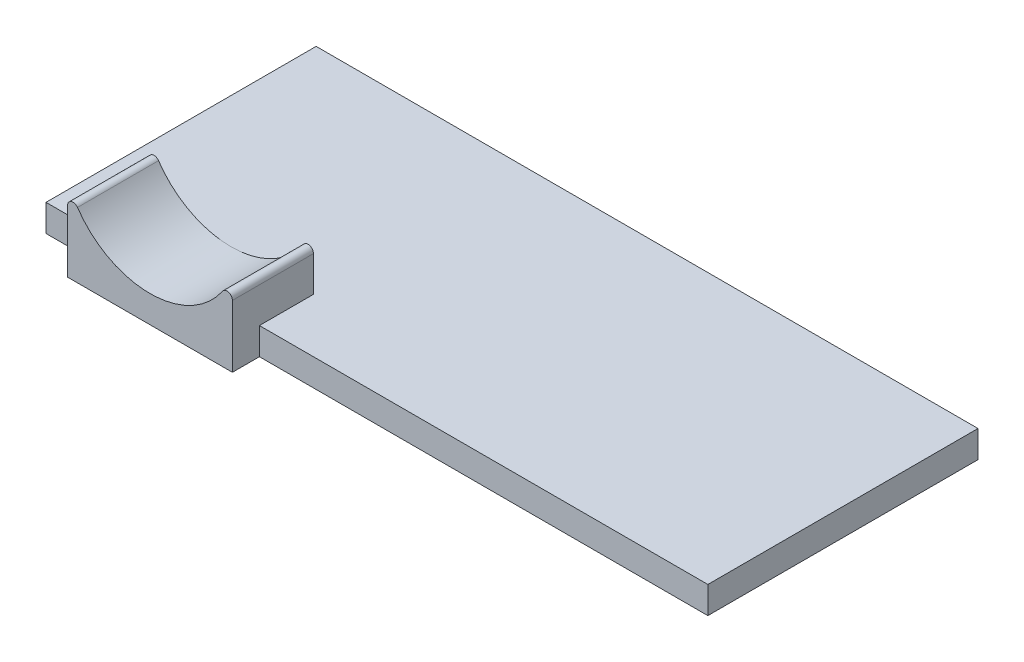
ISO-10303-21;
HEADER;
FILE_DESCRIPTION(('STEP AP214'),'2;1');
FILE_NAME('part.step','',(''),(''),'','','');
FILE_SCHEMA(('AUTOMOTIVE_DESIGN { 1 0 10303 214 1 1 1 1 }'));
ENDSEC;
DATA;
#1=APPLICATION_CONTEXT('core data for automotive mechanical design processes');
#2=APPLICATION_PROTOCOL_DEFINITION('international standard','automotive_design',2000,#1);
#3=PRODUCT_CONTEXT('',#1,'mechanical');
#4=PRODUCT('Part','Part','',(#3));
#5=PRODUCT_RELATED_PRODUCT_CATEGORY('part','',(#4));
#6=PRODUCT_DEFINITION_FORMATION('','',#4);
#7=PRODUCT_DEFINITION_CONTEXT('part definition',#1,'design');
#8=PRODUCT_DEFINITION('design','',#6,#7);
#9=PRODUCT_DEFINITION_SHAPE('','',#8);
#10=(LENGTH_UNIT() NAMED_UNIT(*) SI_UNIT(.MILLI.,.METRE.));
#11=(NAMED_UNIT(*) PLANE_ANGLE_UNIT() SI_UNIT($,.RADIAN.));
#12=(NAMED_UNIT(*) SI_UNIT($,.STERADIAN.) SOLID_ANGLE_UNIT());
#13=UNCERTAINTY_MEASURE_WITH_UNIT(LENGTH_MEASURE(1.E-05),#10,'distance_accuracy_value','');
#14=(GEOMETRIC_REPRESENTATION_CONTEXT(3) GLOBAL_UNCERTAINTY_ASSIGNED_CONTEXT((#13)) GLOBAL_UNIT_ASSIGNED_CONTEXT((#10,
#11,#12)) REPRESENTATION_CONTEXT('',''));
#15=CARTESIAN_POINT('',(0.,0.,0.));
#16=DIRECTION('',(0.,0.,1.));
#17=DIRECTION('',(1.,0.,0.));
#18=AXIS2_PLACEMENT_3D('',#15,#16,#17);
#19=CARTESIAN_POINT('',(-22.7,4.25,-2.));
#20=DIRECTION('',(0.,0.,1.));
#21=DIRECTION('',(1.,0.,0.));
#22=AXIS2_PLACEMENT_3D('',#19,#20,#21);
#23=PLANE('',#22);
#24=DIRECTION('',(0.,-1.,0.));
#25=VECTOR('',#24,1.);
#26=CARTESIAN_POINT('',(-22.7,4.25,-2.));
#27=LINE('',#26,#25);
#28=CARTESIAN_POINT('',(-22.7,2.30577779047765,-2.));
#29=VERTEX_POINT('',#28);
#30=CARTESIAN_POINT('',(-22.7,1.,-2.));
#31=VERTEX_POINT('',#30);
#32=EDGE_CURVE('E164',#29,#31,#27,.T.);
#33=ORIENTED_EDGE('',*,*,#32,.F.);
#34=CARTESIAN_POINT('',(-22.5,2.30577779047764,-2.));
#35=DIRECTION('',(0.,0.,1.));
#36=DIRECTION('',(1.,0.,0.));
#37=AXIS2_PLACEMENT_3D('',#34,#35,#36);
#38=CIRCLE('',#37,0.2);
#39=CARTESIAN_POINT('',(-22.3347826086957,2.418486324363,-2.));
#40=VERTEX_POINT('',#39);
#41=EDGE_CURVE('E11',#29,#40,#38,.F.);
#42=ORIENTED_EDGE('',*,*,#41,.T.);
#43=CARTESIAN_POINT('',(-19.65,4.25,-2.));
#44=DIRECTION('',(0.,0.,1.));
#45=DIRECTION('',(1.,0.,0.));
#46=AXIS2_PLACEMENT_3D('',#43,#44,#45);
#47=CIRCLE('',#46,3.25);
#48=CARTESIAN_POINT('',(-19.65,1.,-2.));
#49=VERTEX_POINT('',#48);
#50=EDGE_CURVE('E128',#49,#40,#47,.F.);
#51=ORIENTED_EDGE('',*,*,#50,.F.);
#52=DIRECTION('',(-1.,0.,0.));
#53=VECTOR('',#52,1.);
#54=CARTESIAN_POINT('',(-22.7,1.,-2.));
#55=LINE('',#54,#53);
#56=EDGE_CURVE('E138',#49,#31,#55,.T.);
#57=ORIENTED_EDGE('',*,*,#56,.T.);
#58=EDGE_LOOP('',(#33,#42,#51,#57));
#59=FACE_BOUND('',#58,.T.);
#60=ADVANCED_FACE('F35',(#59),#23,.F.);
#61=CARTESIAN_POINT('',(0.,1.,0.));
#62=DIRECTION('',(0.,0.,-1.));
#63=DIRECTION('',(-1.,0.,0.));
#64=AXIS2_PLACEMENT_3D('',#61,#62,#63);
#65=PLANE('',#64);
#66=DIRECTION('',(0.,1.,0.));
#67=VECTOR('',#66,1.);
#68=CARTESIAN_POINT('',(-16.6,-6.18142378421024,0.));
#69=LINE('',#68,#67);
#70=CARTESIAN_POINT('',(-16.6,0.,0.));
#71=VERTEX_POINT('',#70);
#72=CARTESIAN_POINT('',(-16.6,1.,0.));
#73=VERTEX_POINT('',#72);
#74=EDGE_CURVE('E134',#71,#73,#69,.T.);
#75=ORIENTED_EDGE('',*,*,#74,.F.);
#76=DIRECTION('',(1.,0.,0.));
#77=VECTOR('',#76,1.);
#78=CARTESIAN_POINT('',(0.,0.,0.));
#79=LINE('',#78,#77);
#80=CARTESIAN_POINT('',(0.,0.,0.));
#81=VERTEX_POINT('',#80);
#82=EDGE_CURVE('E186',#71,#81,#79,.T.);
#83=ORIENTED_EDGE('',*,*,#82,.T.);
#84=DIRECTION('',(0.,-1.,0.));
#85=VECTOR('',#84,1.);
#86=CARTESIAN_POINT('',(0.,1.,0.));
#87=LINE('',#86,#85);
#88=CARTESIAN_POINT('',(0.,1.,0.));
#89=VERTEX_POINT('',#88);
#90=EDGE_CURVE('E179',#89,#81,#87,.T.);
#91=ORIENTED_EDGE('',*,*,#90,.F.);
#92=DIRECTION('',(1.,0.,0.));
#93=VECTOR('',#92,1.);
#94=CARTESIAN_POINT('',(0.,1.,0.));
#95=LINE('',#94,#93);
#96=EDGE_CURVE('E176',#73,#89,#95,.T.);
#97=ORIENTED_EDGE('',*,*,#96,.F.);
#98=EDGE_LOOP('',(#75,#83,#91,#97));
#99=FACE_BOUND('',#98,.T.);
#100=ADVANCED_FACE('F255',(#99),#65,.F.);
#101=DIRECTION('',(0.,1.,0.));
#102=VECTOR('',#101,1.);
#103=CARTESIAN_POINT('',(-22.7,-6.18142378421024,0.));
#104=LINE('',#103,#102);
#105=CARTESIAN_POINT('',(-22.7,0.,0.));
#106=VERTEX_POINT('',#105);
#107=CARTESIAN_POINT('',(-22.7,1.,0.));
#108=VERTEX_POINT('',#107);
#109=EDGE_CURVE('E229',#106,#108,#104,.T.);
#110=ORIENTED_EDGE('',*,*,#109,.T.);
#111=CARTESIAN_POINT('',(-24.5,1.,0.));
#112=VERTEX_POINT('',#111);
#113=EDGE_CURVE('E177',#112,#108,#95,.T.);
#114=ORIENTED_EDGE('',*,*,#113,.F.);
#115=DIRECTION('',(0.,-1.,0.));
#116=VECTOR('',#115,1.);
#117=CARTESIAN_POINT('',(-24.5,1.,0.));
#118=LINE('',#117,#116);
#119=CARTESIAN_POINT('',(-24.5,0.,0.));
#120=VERTEX_POINT('',#119);
#121=EDGE_CURVE('E191',#112,#120,#118,.T.);
#122=ORIENTED_EDGE('',*,*,#121,.T.);
#123=EDGE_CURVE('E172',#120,#106,#79,.T.);
#124=ORIENTED_EDGE('',*,*,#123,.T.);
#125=EDGE_LOOP('',(#110,#114,#122,#124));
#126=FACE_BOUND('',#125,.T.);
#127=ADVANCED_FACE('F239',(#126),#65,.F.);
#128=CARTESIAN_POINT('',(0.,1.,0.));
#129=DIRECTION('',(-1.,0.,0.));
#130=DIRECTION('',(0.,0.,1.));
#131=AXIS2_PLACEMENT_3D('',#128,#129,#130);
#132=PLANE('',#131);
#133=DIRECTION('',(0.,0.,-1.));
#134=VECTOR('',#133,1.);
#135=CARTESIAN_POINT('',(0.,0.,0.));
#136=LINE('',#135,#134);
#137=CARTESIAN_POINT('',(0.,0.,-10.));
#138=VERTEX_POINT('',#137);
#139=EDGE_CURVE('E167',#81,#138,#136,.T.);
#140=ORIENTED_EDGE('',*,*,#139,.T.);
#141=DIRECTION('',(0.,-1.,0.));
#142=VECTOR('',#141,1.);
#143=CARTESIAN_POINT('',(0.,1.,-10.));
#144=LINE('',#143,#142);
#145=CARTESIAN_POINT('',(0.,1.,-10.));
#146=VERTEX_POINT('',#145);
#147=EDGE_CURVE('E197',#146,#138,#144,.T.);
#148=ORIENTED_EDGE('',*,*,#147,.F.);
#149=DIRECTION('',(0.,0.,-1.));
#150=VECTOR('',#149,1.);
#151=CARTESIAN_POINT('',(0.,1.,0.));
#152=LINE('',#151,#150);
#153=EDGE_CURVE('E168',#89,#146,#152,.T.);
#154=ORIENTED_EDGE('',*,*,#153,.F.);
#155=ORIENTED_EDGE('',*,*,#90,.T.);
#156=EDGE_LOOP('',(#140,#148,#154,#155));
#157=FACE_BOUND('',#156,.T.);
#158=ADVANCED_FACE('F251',(#157),#132,.F.);
#159=CARTESIAN_POINT('',(0.,1.,-10.));
#160=DIRECTION('',(0.,0.,1.));
#161=DIRECTION('',(1.,0.,0.));
#162=AXIS2_PLACEMENT_3D('',#159,#160,#161);
#163=PLANE('',#162);
#164=DIRECTION('',(-1.,0.,0.));
#165=VECTOR('',#164,1.);
#166=CARTESIAN_POINT('',(0.,0.,-10.));
#167=LINE('',#166,#165);
#168=CARTESIAN_POINT('',(-24.5,0.,-10.));
#169=VERTEX_POINT('',#168);
#170=EDGE_CURVE('E182',#138,#169,#167,.T.);
#171=ORIENTED_EDGE('',*,*,#170,.T.);
#172=DIRECTION('',(0.,-1.,0.));
#173=VECTOR('',#172,1.);
#174=CARTESIAN_POINT('',(-24.5,1.,-10.));
#175=LINE('',#174,#173);
#176=CARTESIAN_POINT('',(-24.5,1.,-10.));
#177=VERTEX_POINT('',#176);
#178=EDGE_CURVE('E194',#177,#169,#175,.T.);
#179=ORIENTED_EDGE('',*,*,#178,.F.);
#180=DIRECTION('',(-1.,0.,0.));
#181=VECTOR('',#180,1.);
#182=CARTESIAN_POINT('',(0.,1.,-10.));
#183=LINE('',#182,#181);
#184=EDGE_CURVE('E171',#146,#177,#183,.T.);
#185=ORIENTED_EDGE('',*,*,#184,.F.);
#186=ORIENTED_EDGE('',*,*,#147,.T.);
#187=EDGE_LOOP('',(#171,#179,#185,#186));
#188=FACE_BOUND('',#187,.T.);
#189=ADVANCED_FACE('F247',(#188),#163,.F.);
#190=CARTESIAN_POINT('',(-24.5,1.,0.));
#191=DIRECTION('',(1.,0.,0.));
#192=DIRECTION('',(0.,0.,-1.));
#193=AXIS2_PLACEMENT_3D('',#190,#191,#192);
#194=PLANE('',#193);
#195=DIRECTION('',(0.,0.,1.));
#196=VECTOR('',#195,1.);
#197=CARTESIAN_POINT('',(-24.5,0.,0.));
#198=LINE('',#197,#196);
#199=EDGE_CURVE('E184',#169,#120,#198,.T.);
#200=ORIENTED_EDGE('',*,*,#199,.T.);
#201=ORIENTED_EDGE('',*,*,#121,.F.);
#202=DIRECTION('',(0.,0.,1.));
#203=VECTOR('',#202,1.);
#204=CARTESIAN_POINT('',(-24.5,1.,0.));
#205=LINE('',#204,#203);
#206=EDGE_CURVE('E174',#177,#112,#205,.T.);
#207=ORIENTED_EDGE('',*,*,#206,.F.);
#208=ORIENTED_EDGE('',*,*,#178,.T.);
#209=EDGE_LOOP('',(#200,#201,#207,#208));
#210=FACE_BOUND('',#209,.T.);
#211=ADVANCED_FACE('F243',(#210),#194,.F.);
#212=CARTESIAN_POINT('',(0.,1.,0.));
#213=DIRECTION('',(0.,1.,0.));
#214=DIRECTION('',(0.,0.,1.));
#215=AXIS2_PLACEMENT_3D('',#212,#213,#214);
#216=PLANE('',#215);
#217=DIRECTION('',(0.,0.,-1.));
#218=VECTOR('',#217,1.);
#219=CARTESIAN_POINT('',(-16.6,1.,1.));
#220=LINE('',#219,#218);
#221=CARTESIAN_POINT('',(-16.6,1.,-2.));
#222=VERTEX_POINT('',#221);
#223=EDGE_CURVE('E158',#73,#222,#220,.T.);
#224=ORIENTED_EDGE('',*,*,#223,.F.);
#225=ORIENTED_EDGE('',*,*,#96,.T.);
#226=ORIENTED_EDGE('',*,*,#153,.T.);
#227=ORIENTED_EDGE('',*,*,#184,.T.);
#228=ORIENTED_EDGE('',*,*,#206,.T.);
#229=ORIENTED_EDGE('',*,*,#113,.T.);
#230=DIRECTION('',(0.,0.,1.));
#231=VECTOR('',#230,1.);
#232=CARTESIAN_POINT('',(-22.7,1.,1.));
#233=LINE('',#232,#231);
#234=EDGE_CURVE('E149',#31,#108,#233,.T.);
#235=ORIENTED_EDGE('',*,*,#234,.F.);
#236=ORIENTED_EDGE('',*,*,#56,.F.);
#237=EDGE_CURVE('E145',#222,#49,#55,.T.);
#238=ORIENTED_EDGE('',*,*,#237,.F.);
#239=EDGE_LOOP('',(#224,#225,#226,#227,#228,#229,#235,#236,#238));
#240=FACE_BOUND('',#239,.T.);
#241=ADVANCED_FACE('F144',(#240),#216,.T.);
#242=CARTESIAN_POINT('',(0.,0.,0.));
#243=DIRECTION('',(0.,1.,0.));
#244=DIRECTION('',(0.,0.,1.));
#245=AXIS2_PLACEMENT_3D('',#242,#243,#244);
#246=PLANE('',#245);
#247=ORIENTED_EDGE('',*,*,#139,.F.);
#248=ORIENTED_EDGE('',*,*,#82,.F.);
#249=DIRECTION('',(0.,0.,-1.));
#250=VECTOR('',#249,1.);
#251=CARTESIAN_POINT('',(-16.6,0.,0.));
#252=LINE('',#251,#250);
#253=CARTESIAN_POINT('',(-16.6,0.,1.));
#254=VERTEX_POINT('',#253);
#255=EDGE_CURVE('E224',#254,#71,#252,.T.);
#256=ORIENTED_EDGE('',*,*,#255,.F.);
#257=DIRECTION('',(1.,0.,0.));
#258=VECTOR('',#257,1.);
#259=CARTESIAN_POINT('',(-22.7,0.,1.));
#260=LINE('',#259,#258);
#261=CARTESIAN_POINT('',(-22.7,0.,1.));
#262=VERTEX_POINT('',#261);
#263=EDGE_CURVE('E226',#262,#254,#260,.T.);
#264=ORIENTED_EDGE('',*,*,#263,.F.);
#265=DIRECTION('',(0.,0.,1.));
#266=VECTOR('',#265,1.);
#267=CARTESIAN_POINT('',(-22.7,0.,0.));
#268=LINE('',#267,#266);
#269=EDGE_CURVE('E150',#106,#262,#268,.T.);
#270=ORIENTED_EDGE('',*,*,#269,.F.);
#271=ORIENTED_EDGE('',*,*,#123,.F.);
#272=ORIENTED_EDGE('',*,*,#199,.F.);
#273=ORIENTED_EDGE('',*,*,#170,.F.);
#274=EDGE_LOOP('',(#247,#248,#256,#264,#270,#271,#272,#273));
#275=FACE_BOUND('',#274,.T.);
#276=ADVANCED_FACE('F233',(#275),#246,.F.);
#277=CARTESIAN_POINT('',(-16.6,4.25,1.));
#278=DIRECTION('',(-1.,0.,0.));
#279=DIRECTION('',(0.,0.,1.));
#280=AXIS2_PLACEMENT_3D('',#277,#278,#279);
#281=PLANE('',#280);
#282=DIRECTION('',(0.,-1.,0.));
#283=VECTOR('',#282,1.);
#284=CARTESIAN_POINT('',(-16.6,4.25,-2.));
#285=LINE('',#284,#283);
#286=CARTESIAN_POINT('',(-16.6,2.30577779047765,-2.));
#287=VERTEX_POINT('',#286);
#288=EDGE_CURVE('E154',#287,#222,#285,.T.);
#289=ORIENTED_EDGE('',*,*,#288,.F.);
#290=DIRECTION('',(0.,0.,1.));
#291=VECTOR('',#290,1.);
#292=CARTESIAN_POINT('',(-16.6,2.30577779047764,1.));
#293=LINE('',#292,#291);
#294=CARTESIAN_POINT('',(-16.6,2.30577779047765,1.));
#295=VERTEX_POINT('',#294);
#296=EDGE_CURVE('E200',#287,#295,#293,.T.);
#297=ORIENTED_EDGE('',*,*,#296,.T.);
#298=DIRECTION('',(0.,-1.,0.));
#299=VECTOR('',#298,1.);
#300=CARTESIAN_POINT('',(-16.6,4.25,1.));
#301=LINE('',#300,#299);
#302=EDGE_CURVE('E155',#295,#254,#301,.T.);
#303=ORIENTED_EDGE('',*,*,#302,.T.);
#304=ORIENTED_EDGE('',*,*,#255,.T.);
#305=ORIENTED_EDGE('',*,*,#74,.T.);
#306=ORIENTED_EDGE('',*,*,#223,.T.);
#307=EDGE_LOOP('',(#289,#297,#303,#304,#305,#306));
#308=FACE_BOUND('',#307,.T.);
#309=ADVANCED_FACE('F258',(#308),#281,.F.);
#310=CARTESIAN_POINT('',(-16.9652173913043,2.418486324363,-2.));
#311=VERTEX_POINT('',#310);
#312=EDGE_CURVE('E125',#311,#49,#47,.F.);
#313=ORIENTED_EDGE('',*,*,#312,.F.);
#314=CARTESIAN_POINT('',(-16.8,2.30577779047764,-2.));
#315=DIRECTION('',(0.,0.,1.));
#316=DIRECTION('',(1.,0.,0.));
#317=AXIS2_PLACEMENT_3D('',#314,#315,#316);
#318=CIRCLE('',#317,0.2);
#319=EDGE_CURVE('E210',#311,#287,#318,.F.);
#320=ORIENTED_EDGE('',*,*,#319,.T.);
#321=ORIENTED_EDGE('',*,*,#288,.T.);
#322=ORIENTED_EDGE('',*,*,#237,.T.);
#323=EDGE_LOOP('',(#313,#320,#321,#322));
#324=FACE_BOUND('',#323,.T.);
#325=ADVANCED_FACE('F152',(#324),#23,.F.);
#326=CARTESIAN_POINT('',(-22.7,4.25,1.));
#327=DIRECTION('',(1.,0.,0.));
#328=DIRECTION('',(0.,0.,-1.));
#329=AXIS2_PLACEMENT_3D('',#326,#327,#328);
#330=PLANE('',#329);
#331=DIRECTION('',(0.,-1.,0.));
#332=VECTOR('',#331,1.);
#333=CARTESIAN_POINT('',(-22.7,4.25,1.));
#334=LINE('',#333,#332);
#335=CARTESIAN_POINT('',(-22.7,2.30577779047765,1.));
#336=VERTEX_POINT('',#335);
#337=EDGE_CURVE('E162',#336,#262,#334,.T.);
#338=ORIENTED_EDGE('',*,*,#337,.F.);
#339=DIRECTION('',(0.,0.,1.));
#340=VECTOR('',#339,1.);
#341=CARTESIAN_POINT('',(-22.7,2.30577779047764,1.));
#342=LINE('',#341,#340);
#343=EDGE_CURVE('E43',#336,#29,#342,.F.);
#344=ORIENTED_EDGE('',*,*,#343,.T.);
#345=ORIENTED_EDGE('',*,*,#32,.T.);
#346=ORIENTED_EDGE('',*,*,#234,.T.);
#347=ORIENTED_EDGE('',*,*,#109,.F.);
#348=ORIENTED_EDGE('',*,*,#269,.T.);
#349=EDGE_LOOP('',(#338,#344,#345,#346,#347,#348));
#350=FACE_BOUND('',#349,.T.);
#351=ADVANCED_FACE('F213',(#350),#330,.F.);
#352=CARTESIAN_POINT('',(-16.6,4.25,1.));
#353=DIRECTION('',(0.,0.,-1.));
#354=DIRECTION('',(-1.,0.,0.));
#355=AXIS2_PLACEMENT_3D('',#352,#353,#354);
#356=PLANE('',#355);
#357=ORIENTED_EDGE('',*,*,#302,.F.);
#358=CARTESIAN_POINT('',(-16.8,2.30577779047764,1.));
#359=DIRECTION('',(0.,0.,-1.));
#360=DIRECTION('',(-1.,0.,0.));
#361=AXIS2_PLACEMENT_3D('',#358,#359,#360);
#362=CIRCLE('',#361,0.2);
#363=CARTESIAN_POINT('',(-16.9652173913043,2.418486324363,1.));
#364=VERTEX_POINT('',#363);
#365=EDGE_CURVE('E205',#295,#364,#362,.F.);
#366=ORIENTED_EDGE('',*,*,#365,.T.);
#367=CARTESIAN_POINT('',(-19.65,4.25,1.));
#368=DIRECTION('',(0.,0.,1.));
#369=DIRECTION('',(1.,0.,0.));
#370=AXIS2_PLACEMENT_3D('',#367,#368,#369);
#371=CIRCLE('',#370,3.25);
#372=CARTESIAN_POINT('',(-22.3347826086957,2.418486324363,1.));
#373=VERTEX_POINT('',#372);
#374=EDGE_CURVE('E140',#373,#364,#371,.T.);
#375=ORIENTED_EDGE('',*,*,#374,.F.);
#376=CARTESIAN_POINT('',(-22.5,2.30577779047764,1.));
#377=DIRECTION('',(0.,0.,-1.));
#378=DIRECTION('',(-1.,0.,0.));
#379=AXIS2_PLACEMENT_3D('',#376,#377,#378);
#380=CIRCLE('',#379,0.2);
#381=EDGE_CURVE('E203',#373,#336,#380,.F.);
#382=ORIENTED_EDGE('',*,*,#381,.T.);
#383=ORIENTED_EDGE('',*,*,#337,.T.);
#384=ORIENTED_EDGE('',*,*,#263,.T.);
#385=EDGE_LOOP('',(#357,#366,#375,#382,#383,#384));
#386=FACE_BOUND('',#385,.T.);
#387=ADVANCED_FACE('F219',(#386),#356,.F.);
#388=CARTESIAN_POINT('',(-19.65,4.25,-11.1923881554251));
#389=DIRECTION('',(0.,0.,1.));
#390=DIRECTION('',(1.,0.,0.));
#391=AXIS2_PLACEMENT_3D('',#388,#389,#390);
#392=CYLINDRICAL_SURFACE('',#391,3.25);
#393=ORIENTED_EDGE('',*,*,#374,.T.);
#394=DIRECTION('',(0.,0.,1.));
#395=VECTOR('',#394,1.);
#396=CARTESIAN_POINT('',(-16.9652173913043,2.418486324363,-11.1923881554251));
#397=LINE('',#396,#395);
#398=EDGE_CURVE('E130',#364,#311,#397,.F.);
#399=ORIENTED_EDGE('',*,*,#398,.T.);
#400=ORIENTED_EDGE('',*,*,#312,.T.);
#401=ORIENTED_EDGE('',*,*,#50,.T.);
#402=DIRECTION('',(0.,0.,1.));
#403=VECTOR('',#402,1.);
#404=CARTESIAN_POINT('',(-22.3347826086957,2.418486324363,-11.1923881554251));
#405=LINE('',#404,#403);
#406=EDGE_CURVE('E207',#40,#373,#405,.T.);
#407=ORIENTED_EDGE('',*,*,#406,.T.);
#408=EDGE_LOOP('',(#393,#399,#400,#401,#407));
#409=FACE_BOUND('',#408,.T.);
#410=ADVANCED_FACE('F127',(#409),#392,.F.);
#411=CARTESIAN_POINT('',(-16.8,2.30577779047764,-11.1923881554251));
#412=DIRECTION('',(0.,0.,1.));
#413=DIRECTION('',(1.,0.,0.));
#414=AXIS2_PLACEMENT_3D('',#411,#412,#413);
#415=CYLINDRICAL_SURFACE('',#414,0.2);
#416=ORIENTED_EDGE('',*,*,#319,.F.);
#417=ORIENTED_EDGE('',*,*,#398,.F.);
#418=ORIENTED_EDGE('',*,*,#365,.F.);
#419=ORIENTED_EDGE('',*,*,#296,.F.);
#420=EDGE_LOOP('',(#416,#417,#418,#419));
#421=FACE_BOUND('',#420,.T.);
#422=ADVANCED_FACE('F261',(#421),#415,.T.);
#423=CARTESIAN_POINT('',(-22.5,2.30577779047764,-11.1923881554251));
#424=DIRECTION('',(0.,0.,1.));
#425=DIRECTION('',(1.,0.,0.));
#426=AXIS2_PLACEMENT_3D('',#423,#424,#425);
#427=CYLINDRICAL_SURFACE('',#426,0.2);
#428=ORIENTED_EDGE('',*,*,#381,.F.);
#429=ORIENTED_EDGE('',*,*,#406,.F.);
#430=ORIENTED_EDGE('',*,*,#41,.F.);
#431=ORIENTED_EDGE('',*,*,#343,.F.);
#432=EDGE_LOOP('',(#428,#429,#430,#431));
#433=FACE_BOUND('',#432,.T.);
#434=ADVANCED_FACE('F37',(#433),#427,.T.);
#435=CLOSED_SHELL('',(#60,#100,#127,#158,#189,#211,#241,#276,#309,#325,#351,#387,#410,#422,#434));
#436=MANIFOLD_SOLID_BREP('B2',#435);
#437=ADVANCED_BREP_SHAPE_REPRESENTATION('',(#18,#436),#14);
#438=SHAPE_DEFINITION_REPRESENTATION(#9,#437);
ENDSEC;
END-ISO-10303-21;
